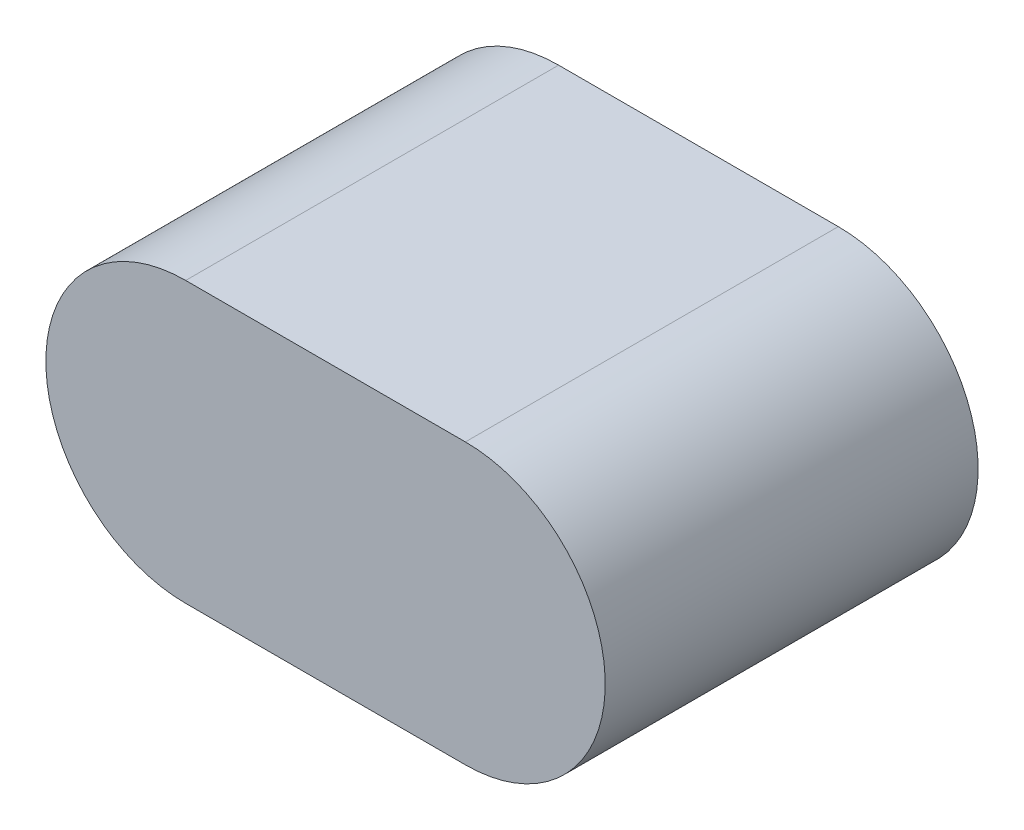
ISO-10303-21;
HEADER;
FILE_DESCRIPTION(('STEP AP214'),'2;1');
FILE_NAME('part.step','',(''),(''),'','','');
FILE_SCHEMA(('AUTOMOTIVE_DESIGN { 1 0 10303 214 1 1 1 1 }'));
ENDSEC;
DATA;
#1=APPLICATION_CONTEXT('core data for automotive mechanical design processes');
#2=APPLICATION_PROTOCOL_DEFINITION('international standard','automotive_design',2000,#1);
#3=PRODUCT_CONTEXT('',#1,'mechanical');
#4=PRODUCT('Part','Part','',(#3));
#5=PRODUCT_RELATED_PRODUCT_CATEGORY('part','',(#4));
#6=PRODUCT_DEFINITION_FORMATION('','',#4);
#7=PRODUCT_DEFINITION_CONTEXT('part definition',#1,'design');
#8=PRODUCT_DEFINITION('design','',#6,#7);
#9=PRODUCT_DEFINITION_SHAPE('','',#8);
#10=(LENGTH_UNIT() NAMED_UNIT(*) SI_UNIT(.MILLI.,.METRE.));
#11=(NAMED_UNIT(*) PLANE_ANGLE_UNIT() SI_UNIT($,.RADIAN.));
#12=(NAMED_UNIT(*) SI_UNIT($,.STERADIAN.) SOLID_ANGLE_UNIT());
#13=UNCERTAINTY_MEASURE_WITH_UNIT(LENGTH_MEASURE(1.E-05),#10,'distance_accuracy_value','');
#14=(GEOMETRIC_REPRESENTATION_CONTEXT(3) GLOBAL_UNCERTAINTY_ASSIGNED_CONTEXT((#13)) GLOBAL_UNIT_ASSIGNED_CONTEXT((#10,
#11,#12)) REPRESENTATION_CONTEXT('',''));
#15=CARTESIAN_POINT('',(0.,0.,0.));
#16=DIRECTION('',(0.,0.,1.));
#17=DIRECTION('',(1.,0.,0.));
#18=AXIS2_PLACEMENT_3D('',#15,#16,#17);
#19=CARTESIAN_POINT('',(-150.,-75.,100.));
#20=DIRECTION('',(0.,0.,1.));
#21=DIRECTION('',(1.,0.,0.));
#22=AXIS2_PLACEMENT_3D('',#19,#20,#21);
#23=PLANE('',#22);
#24=CARTESIAN_POINT('',(75.,0.,100.));
#25=DIRECTION('',(0.,0.,1.));
#26=DIRECTION('',(-1.,0.,0.));
#27=AXIS2_PLACEMENT_3D('',#24,#25,#26);
#28=CIRCLE('',#27,75.);
#29=CARTESIAN_POINT('',(74.9999999999999,-75.0000000000001,100.));
#30=VERTEX_POINT('',#29);
#31=CARTESIAN_POINT('',(75.0000000000001,74.9999999999999,100.));
#32=VERTEX_POINT('',#31);
#33=EDGE_CURVE('E76',#30,#32,#28,.T.);
#34=ORIENTED_EDGE('',*,*,#33,.T.);
#35=DIRECTION('',(1.,0.,0.));
#36=VECTOR('',#35,1.);
#37=CARTESIAN_POINT('',(-150.,75.,100.));
#38=LINE('',#37,#36);
#39=CARTESIAN_POINT('',(-75.,75.,100.));
#40=VERTEX_POINT('',#39);
#41=EDGE_CURVE('E78',#40,#32,#38,.T.);
#42=ORIENTED_EDGE('',*,*,#41,.F.);
#43=CARTESIAN_POINT('',(-75.,0.,100.));
#44=DIRECTION('',(0.,0.,1.));
#45=DIRECTION('',(1.,0.,0.));
#46=AXIS2_PLACEMENT_3D('',#43,#44,#45);
#47=CIRCLE('',#46,75.);
#48=CARTESIAN_POINT('',(-75.,-75.,100.));
#49=VERTEX_POINT('',#48);
#50=EDGE_CURVE('E49',#40,#49,#47,.T.);
#51=ORIENTED_EDGE('',*,*,#50,.T.);
#52=DIRECTION('',(1.,0.,0.));
#53=VECTOR('',#52,1.);
#54=CARTESIAN_POINT('',(-150.,-75.,100.));
#55=LINE('',#54,#53);
#56=EDGE_CURVE('E12',#49,#30,#55,.T.);
#57=ORIENTED_EDGE('',*,*,#56,.T.);
#58=EDGE_LOOP('',(#34,#42,#51,#57));
#59=FACE_BOUND('',#58,.T.);
#60=ADVANCED_FACE('F34',(#59),#23,.T.);
#61=CARTESIAN_POINT('',(-150.,-75.,-100.));
#62=DIRECTION('',(0.,0.,-1.));
#63=DIRECTION('',(-1.,0.,0.));
#64=AXIS2_PLACEMENT_3D('',#61,#62,#63);
#65=PLANE('',#64);
#66=DIRECTION('',(-1.,0.,0.));
#67=VECTOR('',#66,1.);
#68=CARTESIAN_POINT('',(-150.,75.,-100.));
#69=LINE('',#68,#67);
#70=CARTESIAN_POINT('',(75.,75.,-100.));
#71=VERTEX_POINT('',#70);
#72=CARTESIAN_POINT('',(-75.,75.,-100.));
#73=VERTEX_POINT('',#72);
#74=EDGE_CURVE('E91',#71,#73,#69,.T.);
#75=ORIENTED_EDGE('',*,*,#74,.F.);
#76=CARTESIAN_POINT('',(75.,0.,-100.));
#77=DIRECTION('',(0.,0.,1.));
#78=DIRECTION('',(-1.,0.,0.));
#79=AXIS2_PLACEMENT_3D('',#76,#77,#78);
#80=CIRCLE('',#79,75.);
#81=CARTESIAN_POINT('',(74.9999999999999,-75.0000000000001,-100.));
#82=VERTEX_POINT('',#81);
#83=EDGE_CURVE('E57',#82,#71,#80,.T.);
#84=ORIENTED_EDGE('',*,*,#83,.F.);
#85=DIRECTION('',(-1.,0.,0.));
#86=VECTOR('',#85,1.);
#87=CARTESIAN_POINT('',(-150.,-75.,-100.));
#88=LINE('',#87,#86);
#89=CARTESIAN_POINT('',(-75.,-75.,-100.));
#90=VERTEX_POINT('',#89);
#91=EDGE_CURVE('E42',#82,#90,#88,.T.);
#92=ORIENTED_EDGE('',*,*,#91,.T.);
#93=CARTESIAN_POINT('',(-75.,0.,-100.));
#94=DIRECTION('',(0.,0.,1.));
#95=DIRECTION('',(1.,0.,0.));
#96=AXIS2_PLACEMENT_3D('',#93,#94,#95);
#97=CIRCLE('',#96,75.);
#98=EDGE_CURVE('E88',#73,#90,#97,.T.);
#99=ORIENTED_EDGE('',*,*,#98,.F.);
#100=EDGE_LOOP('',(#75,#84,#92,#99));
#101=FACE_BOUND('',#100,.T.);
#102=ADVANCED_FACE('F36',(#101),#65,.T.);
#103=CARTESIAN_POINT('',(0.,-75.,0.));
#104=DIRECTION('',(0.,1.,0.));
#105=DIRECTION('',(0.,0.,1.));
#106=AXIS2_PLACEMENT_3D('',#103,#104,#105);
#107=PLANE('',#106);
#108=ORIENTED_EDGE('',*,*,#91,.F.);
#109=DIRECTION('',(0.,0.,1.));
#110=VECTOR('',#109,1.);
#111=CARTESIAN_POINT('',(74.9999999999999,-75.0000000000001,-100.));
#112=LINE('',#111,#110);
#113=EDGE_CURVE('E94',#82,#30,#112,.T.);
#114=ORIENTED_EDGE('',*,*,#113,.T.);
#115=ORIENTED_EDGE('',*,*,#56,.F.);
#116=DIRECTION('',(0.,0.,1.));
#117=VECTOR('',#116,1.);
#118=CARTESIAN_POINT('',(-75.,-75.,-100.));
#119=LINE('',#118,#117);
#120=EDGE_CURVE('E98',#90,#49,#119,.T.);
#121=ORIENTED_EDGE('',*,*,#120,.F.);
#122=EDGE_LOOP('',(#108,#114,#115,#121));
#123=FACE_BOUND('',#122,.T.);
#124=ADVANCED_FACE('F107',(#123),#107,.F.);
#125=CARTESIAN_POINT('',(0.,75.,0.));
#126=DIRECTION('',(0.,1.,0.));
#127=DIRECTION('',(0.,0.,1.));
#128=AXIS2_PLACEMENT_3D('',#125,#126,#127);
#129=PLANE('',#128);
#130=DIRECTION('',(0.,0.,1.));
#131=VECTOR('',#130,1.);
#132=CARTESIAN_POINT('',(75.0000000000001,74.9999999999999,-100.));
#133=LINE('',#132,#131);
#134=EDGE_CURVE('E82',#71,#32,#133,.T.);
#135=ORIENTED_EDGE('',*,*,#134,.F.);
#136=ORIENTED_EDGE('',*,*,#74,.T.);
#137=DIRECTION('',(0.,0.,1.));
#138=VECTOR('',#137,1.);
#139=CARTESIAN_POINT('',(-75.,75.,-100.));
#140=LINE('',#139,#138);
#141=EDGE_CURVE('E87',#73,#40,#140,.T.);
#142=ORIENTED_EDGE('',*,*,#141,.T.);
#143=ORIENTED_EDGE('',*,*,#41,.T.);
#144=EDGE_LOOP('',(#135,#136,#142,#143));
#145=FACE_BOUND('',#144,.T.);
#146=ADVANCED_FACE('F90',(#145),#129,.T.);
#147=CARTESIAN_POINT('',(-75.,0.,-100.));
#148=DIRECTION('',(0.,0.,1.));
#149=DIRECTION('',(1.,0.,0.));
#150=AXIS2_PLACEMENT_3D('',#147,#148,#149);
#151=CYLINDRICAL_SURFACE('',#150,75.);
#152=ORIENTED_EDGE('',*,*,#141,.F.);
#153=ORIENTED_EDGE('',*,*,#98,.T.);
#154=ORIENTED_EDGE('',*,*,#120,.T.);
#155=ORIENTED_EDGE('',*,*,#50,.F.);
#156=EDGE_LOOP('',(#152,#153,#154,#155));
#157=FACE_BOUND('',#156,.T.);
#158=ADVANCED_FACE('F104',(#157),#151,.T.);
#159=CARTESIAN_POINT('',(75.,0.,-100.));
#160=DIRECTION('',(0.,0.,1.));
#161=DIRECTION('',(1.,0.,0.));
#162=AXIS2_PLACEMENT_3D('',#159,#160,#161);
#163=CYLINDRICAL_SURFACE('',#162,75.);
#164=ORIENTED_EDGE('',*,*,#83,.T.);
#165=ORIENTED_EDGE('',*,*,#134,.T.);
#166=ORIENTED_EDGE('',*,*,#33,.F.);
#167=ORIENTED_EDGE('',*,*,#113,.F.);
#168=EDGE_LOOP('',(#164,#165,#166,#167));
#169=FACE_BOUND('',#168,.T.);
#170=ADVANCED_FACE('F83',(#169),#163,.T.);
#171=CLOSED_SHELL('',(#60,#102,#124,#146,#158,#170));
#172=MANIFOLD_SOLID_BREP('B2',#171);
#173=ADVANCED_BREP_SHAPE_REPRESENTATION('',(#18,#172),#14);
#174=SHAPE_DEFINITION_REPRESENTATION(#9,#173);
ENDSEC;
END-ISO-10303-21;
